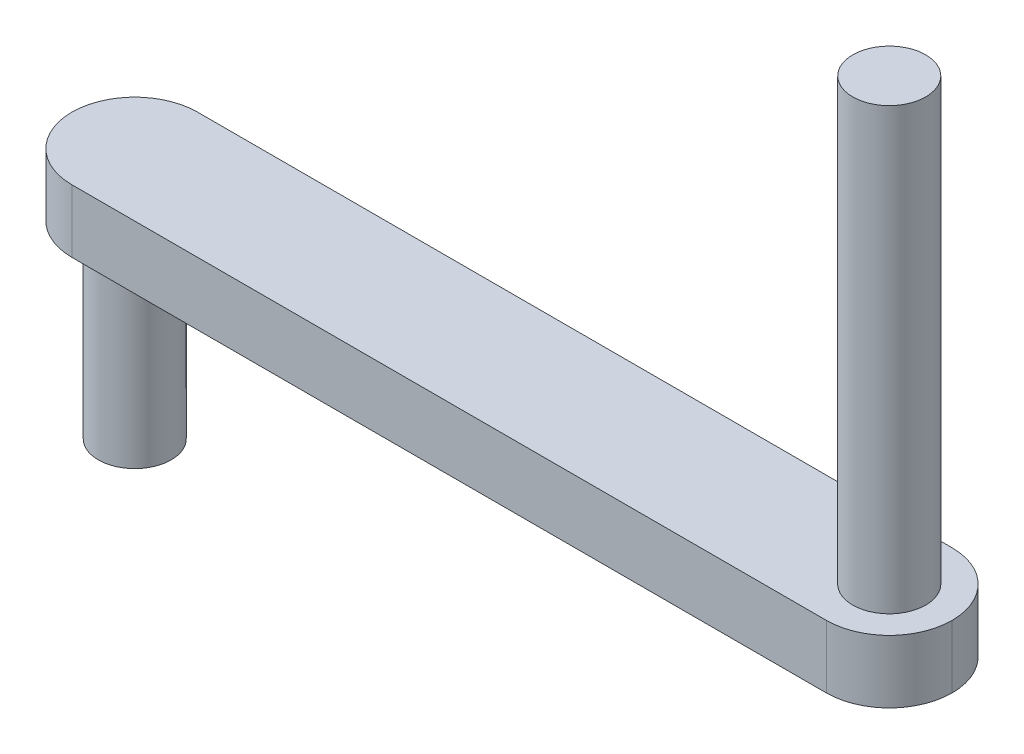
ISO-10303-21;
HEADER;
FILE_DESCRIPTION(('STEP AP214'),'2;1');
FILE_NAME('part.step','',(''),(''),'','','');
FILE_SCHEMA(('AUTOMOTIVE_DESIGN { 1 0 10303 214 1 1 1 1 }'));
ENDSEC;
DATA;
#1=APPLICATION_CONTEXT('core data for automotive mechanical design processes');
#2=APPLICATION_PROTOCOL_DEFINITION('international standard','automotive_design',2000,#1);
#3=PRODUCT_CONTEXT('',#1,'mechanical');
#4=PRODUCT('Part','Part','',(#3));
#5=PRODUCT_RELATED_PRODUCT_CATEGORY('part','',(#4));
#6=PRODUCT_DEFINITION_FORMATION('','',#4);
#7=PRODUCT_DEFINITION_CONTEXT('part definition',#1,'design');
#8=PRODUCT_DEFINITION('design','',#6,#7);
#9=PRODUCT_DEFINITION_SHAPE('','',#8);
#10=(LENGTH_UNIT() NAMED_UNIT(*) SI_UNIT(.MILLI.,.METRE.));
#11=(NAMED_UNIT(*) PLANE_ANGLE_UNIT() SI_UNIT($,.RADIAN.));
#12=(NAMED_UNIT(*) SI_UNIT($,.STERADIAN.) SOLID_ANGLE_UNIT());
#13=UNCERTAINTY_MEASURE_WITH_UNIT(LENGTH_MEASURE(1.E-05),#10,'distance_accuracy_value','');
#14=(GEOMETRIC_REPRESENTATION_CONTEXT(3) GLOBAL_UNCERTAINTY_ASSIGNED_CONTEXT((#13)) GLOBAL_UNIT_ASSIGNED_CONTEXT((#10,
#11,#12)) REPRESENTATION_CONTEXT('',''));
#15=CARTESIAN_POINT('',(0.,0.,0.));
#16=DIRECTION('',(0.,0.,1.));
#17=DIRECTION('',(1.,0.,0.));
#18=AXIS2_PLACEMENT_3D('',#15,#16,#17);
#19=CARTESIAN_POINT('',(0.,5.,0.));
#20=DIRECTION('',(0.,0.,-1.));
#21=DIRECTION('',(-1.,0.,0.));
#22=AXIS2_PLACEMENT_3D('',#19,#20,#21);
#23=PLANE('',#22);
#24=DIRECTION('',(1.,0.,0.));
#25=VECTOR('',#24,1.);
#26=CARTESIAN_POINT('',(0.,0.,0.));
#27=LINE('',#26,#25);
#28=CARTESIAN_POINT('',(5.,0.,0.));
#29=VERTEX_POINT('',#28);
#30=CARTESIAN_POINT('',(65.,0.,0.));
#31=VERTEX_POINT('',#30);
#32=EDGE_CURVE('E123',#29,#31,#27,.T.);
#33=ORIENTED_EDGE('',*,*,#32,.T.);
#34=DIRECTION('',(0.,-1.,0.));
#35=VECTOR('',#34,1.);
#36=CARTESIAN_POINT('',(65.,5.,0.));
#37=LINE('',#36,#35);
#38=CARTESIAN_POINT('',(65.,5.,0.));
#39=VERTEX_POINT('',#38);
#40=EDGE_CURVE('E48',#31,#39,#37,.F.);
#41=ORIENTED_EDGE('',*,*,#40,.T.);
#42=DIRECTION('',(1.,0.,0.));
#43=VECTOR('',#42,1.);
#44=CARTESIAN_POINT('',(0.,5.,0.));
#45=LINE('',#44,#43);
#46=CARTESIAN_POINT('',(5.,5.,0.));
#47=VERTEX_POINT('',#46);
#48=EDGE_CURVE('E122',#47,#39,#45,.T.);
#49=ORIENTED_EDGE('',*,*,#48,.F.);
#50=DIRECTION('',(0.,-1.,0.));
#51=VECTOR('',#50,1.);
#52=CARTESIAN_POINT('',(5.,5.,0.));
#53=LINE('',#52,#51);
#54=EDGE_CURVE('E139',#47,#29,#53,.T.);
#55=ORIENTED_EDGE('',*,*,#54,.T.);
#56=EDGE_LOOP('',(#33,#41,#49,#55));
#57=FACE_BOUND('',#56,.T.);
#58=ADVANCED_FACE('F39',(#57),#23,.F.);
#59=CARTESIAN_POINT('',(0.,5.,-10.));
#60=DIRECTION('',(0.,0.,1.));
#61=DIRECTION('',(1.,0.,0.));
#62=AXIS2_PLACEMENT_3D('',#59,#60,#61);
#63=PLANE('',#62);
#64=DIRECTION('',(-1.,0.,0.));
#65=VECTOR('',#64,1.);
#66=CARTESIAN_POINT('',(0.,5.,-10.));
#67=LINE('',#66,#65);
#68=CARTESIAN_POINT('',(65.,5.,-10.));
#69=VERTEX_POINT('',#68);
#70=CARTESIAN_POINT('',(5.,5.,-10.));
#71=VERTEX_POINT('',#70);
#72=EDGE_CURVE('E115',#69,#71,#67,.T.);
#73=ORIENTED_EDGE('',*,*,#72,.F.);
#74=DIRECTION('',(0.,-1.,0.));
#75=VECTOR('',#74,1.);
#76=CARTESIAN_POINT('',(65.,5.,-10.));
#77=LINE('',#76,#75);
#78=CARTESIAN_POINT('',(65.,0.,-10.));
#79=VERTEX_POINT('',#78);
#80=EDGE_CURVE('E99',#69,#79,#77,.T.);
#81=ORIENTED_EDGE('',*,*,#80,.T.);
#82=DIRECTION('',(-1.,0.,0.));
#83=VECTOR('',#82,1.);
#84=CARTESIAN_POINT('',(0.,0.,-10.));
#85=LINE('',#84,#83);
#86=CARTESIAN_POINT('',(5.,0.,-10.));
#87=VERTEX_POINT('',#86);
#88=EDGE_CURVE('E112',#79,#87,#85,.T.);
#89=ORIENTED_EDGE('',*,*,#88,.T.);
#90=DIRECTION('',(0.,-1.,0.));
#91=VECTOR('',#90,1.);
#92=CARTESIAN_POINT('',(5.,5.,-10.));
#93=LINE('',#92,#91);
#94=EDGE_CURVE('E117',#87,#71,#93,.F.);
#95=ORIENTED_EDGE('',*,*,#94,.T.);
#96=EDGE_LOOP('',(#73,#81,#89,#95));
#97=FACE_BOUND('',#96,.T.);
#98=ADVANCED_FACE('F110',(#97),#63,.F.);
#99=CARTESIAN_POINT('',(0.,5.,0.));
#100=DIRECTION('',(0.,-1.,0.));
#101=DIRECTION('',(0.,0.,-1.));
#102=AXIS2_PLACEMENT_3D('',#99,#100,#101);
#103=PLANE('',#102);
#104=CARTESIAN_POINT('',(65.,5.,-5.));
#105=DIRECTION('',(0.,1.,0.));
#106=DIRECTION('',(0.,0.,1.));
#107=AXIS2_PLACEMENT_3D('',#104,#105,#106);
#108=CIRCLE('',#107,2.9);
#109=CARTESIAN_POINT('',(65.,5.,-2.1));
#110=VERTEX_POINT('',#109);
#111=EDGE_CURVE('E11',#110,#110,#108,.T.);
#112=ORIENTED_EDGE('',*,*,#111,.F.);
#113=EDGE_LOOP('',(#112));
#114=FACE_BOUND('',#113,.T.);
#115=CARTESIAN_POINT('',(65.,5.,-5.));
#116=DIRECTION('',(0.,-1.,0.));
#117=DIRECTION('',(0.,0.,-1.));
#118=AXIS2_PLACEMENT_3D('',#115,#116,#117);
#119=CIRCLE('',#118,5.);
#120=CARTESIAN_POINT('',(70.,5.,-5.));
#121=VERTEX_POINT('',#120);
#122=EDGE_CURVE('E56',#39,#121,#119,.F.);
#123=ORIENTED_EDGE('',*,*,#122,.T.);
#124=CARTESIAN_POINT('',(65.,5.,-5.));
#125=DIRECTION('',(0.,-1.,0.));
#126=DIRECTION('',(0.,0.,-1.));
#127=AXIS2_PLACEMENT_3D('',#124,#125,#126);
#128=CIRCLE('',#127,5.);
#129=EDGE_CURVE('E137',#121,#69,#128,.F.);
#130=ORIENTED_EDGE('',*,*,#129,.T.);
#131=ORIENTED_EDGE('',*,*,#72,.T.);
#132=CARTESIAN_POINT('',(5.,5.,-5.));
#133=DIRECTION('',(0.,-1.,0.));
#134=DIRECTION('',(0.,0.,-1.));
#135=AXIS2_PLACEMENT_3D('',#132,#133,#134);
#136=CIRCLE('',#135,5.);
#137=CARTESIAN_POINT('',(0.,5.,-5.));
#138=VERTEX_POINT('',#137);
#139=EDGE_CURVE('E134',#71,#138,#136,.F.);
#140=ORIENTED_EDGE('',*,*,#139,.T.);
#141=CARTESIAN_POINT('',(5.,5.,-5.));
#142=DIRECTION('',(0.,-1.,0.));
#143=DIRECTION('',(0.,0.,-1.));
#144=AXIS2_PLACEMENT_3D('',#141,#142,#143);
#145=CIRCLE('',#144,5.);
#146=EDGE_CURVE('E104',#138,#47,#145,.F.);
#147=ORIENTED_EDGE('',*,*,#146,.T.);
#148=ORIENTED_EDGE('',*,*,#48,.T.);
#149=EDGE_LOOP('',(#123,#130,#131,#140,#147,#148));
#150=FACE_BOUND('',#149,.T.);
#151=ADVANCED_FACE('F154',(#114,#150),#103,.F.);
#152=CARTESIAN_POINT('',(0.,0.,0.));
#153=DIRECTION('',(0.,-1.,0.));
#154=DIRECTION('',(0.,0.,-1.));
#155=AXIS2_PLACEMENT_3D('',#152,#153,#154);
#156=PLANE('',#155);
#157=CARTESIAN_POINT('',(5.,0.,-5.));
#158=DIRECTION('',(0.,-1.,0.));
#159=DIRECTION('',(0.,0.,-1.));
#160=AXIS2_PLACEMENT_3D('',#157,#158,#159);
#161=CIRCLE('',#160,2.9);
#162=CARTESIAN_POINT('',(5.,0.,-7.9));
#163=VERTEX_POINT('',#162);
#164=EDGE_CURVE('E146',#163,#163,#161,.T.);
#165=ORIENTED_EDGE('',*,*,#164,.F.);
#166=EDGE_LOOP('',(#165));
#167=FACE_BOUND('',#166,.T.);
#168=ORIENTED_EDGE('',*,*,#88,.F.);
#169=CARTESIAN_POINT('',(65.,0.,-5.));
#170=DIRECTION('',(0.,-1.,0.));
#171=DIRECTION('',(0.,0.,-1.));
#172=AXIS2_PLACEMENT_3D('',#169,#170,#171);
#173=CIRCLE('',#172,5.);
#174=CARTESIAN_POINT('',(70.,0.,-5.));
#175=VERTEX_POINT('',#174);
#176=EDGE_CURVE('E95',#79,#175,#173,.T.);
#177=ORIENTED_EDGE('',*,*,#176,.T.);
#178=CARTESIAN_POINT('',(65.,0.,-5.));
#179=DIRECTION('',(0.,-1.,0.));
#180=DIRECTION('',(0.,0.,-1.));
#181=AXIS2_PLACEMENT_3D('',#178,#179,#180);
#182=CIRCLE('',#181,5.);
#183=EDGE_CURVE('E105',#175,#31,#182,.T.);
#184=ORIENTED_EDGE('',*,*,#183,.T.);
#185=ORIENTED_EDGE('',*,*,#32,.F.);
#186=CARTESIAN_POINT('',(5.,0.,-5.));
#187=DIRECTION('',(0.,-1.,0.));
#188=DIRECTION('',(0.,0.,-1.));
#189=AXIS2_PLACEMENT_3D('',#186,#187,#188);
#190=CIRCLE('',#189,5.);
#191=CARTESIAN_POINT('',(0.,0.,-5.));
#192=VERTEX_POINT('',#191);
#193=EDGE_CURVE('E116',#29,#192,#190,.T.);
#194=ORIENTED_EDGE('',*,*,#193,.T.);
#195=CARTESIAN_POINT('',(5.,0.,-5.));
#196=DIRECTION('',(0.,-1.,0.));
#197=DIRECTION('',(0.,0.,-1.));
#198=AXIS2_PLACEMENT_3D('',#195,#196,#197);
#199=CIRCLE('',#198,5.);
#200=EDGE_CURVE('E121',#192,#87,#199,.T.);
#201=ORIENTED_EDGE('',*,*,#200,.T.);
#202=EDGE_LOOP('',(#168,#177,#184,#185,#194,#201));
#203=FACE_BOUND('',#202,.T.);
#204=ADVANCED_FACE('F119',(#167,#203),#156,.T.);
#205=CARTESIAN_POINT('',(65.,5.,-5.));
#206=DIRECTION('',(0.,-1.,0.));
#207=DIRECTION('',(0.,0.,-1.));
#208=AXIS2_PLACEMENT_3D('',#205,#206,#207);
#209=CYLINDRICAL_SURFACE('',#208,5.);
#210=DIRECTION('',(0.,-1.,0.));
#211=VECTOR('',#210,1.);
#212=CARTESIAN_POINT('',(70.,5.,-5.));
#213=LINE('',#212,#211);
#214=EDGE_CURVE('E100',#121,#175,#213,.T.);
#215=ORIENTED_EDGE('',*,*,#214,.F.);
#216=ORIENTED_EDGE('',*,*,#122,.F.);
#217=ORIENTED_EDGE('',*,*,#40,.F.);
#218=ORIENTED_EDGE('',*,*,#183,.F.);
#219=EDGE_LOOP('',(#215,#216,#217,#218));
#220=FACE_BOUND('',#219,.T.);
#221=ADVANCED_FACE('F161',(#220),#209,.T.);
#222=CARTESIAN_POINT('',(65.,5.,-5.));
#223=DIRECTION('',(0.,-1.,0.));
#224=DIRECTION('',(0.,0.,-1.));
#225=AXIS2_PLACEMENT_3D('',#222,#223,#224);
#226=CYLINDRICAL_SURFACE('',#225,5.);
#227=ORIENTED_EDGE('',*,*,#129,.F.);
#228=ORIENTED_EDGE('',*,*,#214,.T.);
#229=ORIENTED_EDGE('',*,*,#176,.F.);
#230=ORIENTED_EDGE('',*,*,#80,.F.);
#231=EDGE_LOOP('',(#227,#228,#229,#230));
#232=FACE_BOUND('',#231,.T.);
#233=ADVANCED_FACE('F98',(#232),#226,.T.);
#234=CARTESIAN_POINT('',(5.,5.,-5.));
#235=DIRECTION('',(0.,-1.,0.));
#236=DIRECTION('',(0.,0.,-1.));
#237=AXIS2_PLACEMENT_3D('',#234,#235,#236);
#238=CYLINDRICAL_SURFACE('',#237,5.);
#239=ORIENTED_EDGE('',*,*,#54,.F.);
#240=ORIENTED_EDGE('',*,*,#146,.F.);
#241=DIRECTION('',(0.,-1.,0.));
#242=VECTOR('',#241,1.);
#243=CARTESIAN_POINT('',(0.,5.,-5.));
#244=LINE('',#243,#242);
#245=EDGE_CURVE('E43',#192,#138,#244,.F.);
#246=ORIENTED_EDGE('',*,*,#245,.F.);
#247=ORIENTED_EDGE('',*,*,#193,.F.);
#248=EDGE_LOOP('',(#239,#240,#246,#247));
#249=FACE_BOUND('',#248,.T.);
#250=ADVANCED_FACE('F41',(#249),#238,.T.);
#251=CARTESIAN_POINT('',(5.,5.,-5.));
#252=DIRECTION('',(0.,-1.,0.));
#253=DIRECTION('',(0.,0.,-1.));
#254=AXIS2_PLACEMENT_3D('',#251,#252,#253);
#255=CYLINDRICAL_SURFACE('',#254,5.);
#256=ORIENTED_EDGE('',*,*,#139,.F.);
#257=ORIENTED_EDGE('',*,*,#94,.F.);
#258=ORIENTED_EDGE('',*,*,#200,.F.);
#259=ORIENTED_EDGE('',*,*,#245,.T.);
#260=EDGE_LOOP('',(#256,#257,#258,#259));
#261=FACE_BOUND('',#260,.T.);
#262=ADVANCED_FACE('F185',(#261),#255,.T.);
#263=CARTESIAN_POINT('',(5.,-15.,-5.));
#264=DIRECTION('',(0.,1.,0.));
#265=DIRECTION('',(0.,0.,1.));
#266=AXIS2_PLACEMENT_3D('',#263,#264,#265);
#267=CYLINDRICAL_SURFACE('',#266,2.9);
#268=CARTESIAN_POINT('',(5.,-15.,-5.));
#269=DIRECTION('',(0.,-1.,0.));
#270=DIRECTION('',(0.,0.,-1.));
#271=AXIS2_PLACEMENT_3D('',#268,#269,#270);
#272=CIRCLE('',#271,2.9);
#273=CARTESIAN_POINT('',(5.,-15.,-7.9));
#274=VERTEX_POINT('',#273);
#275=EDGE_CURVE('E142',#274,#274,#272,.T.);
#276=ORIENTED_EDGE('',*,*,#275,.F.);
#277=EDGE_LOOP('',(#276));
#278=FACE_BOUND('',#277,.T.);
#279=ORIENTED_EDGE('',*,*,#164,.T.);
#280=EDGE_LOOP('',(#279));
#281=FACE_BOUND('',#280,.T.);
#282=ADVANCED_FACE('F181',(#278,#281),#267,.T.);
#283=CARTESIAN_POINT('',(5.,-15.,-5.));
#284=DIRECTION('',(0.,-1.,0.));
#285=DIRECTION('',(0.,0.,-1.));
#286=AXIS2_PLACEMENT_3D('',#283,#284,#285);
#287=PLANE('',#286);
#288=ORIENTED_EDGE('',*,*,#275,.T.);
#289=EDGE_LOOP('',(#288));
#290=FACE_BOUND('',#289,.T.);
#291=ADVANCED_FACE('F184',(#290),#287,.T.);
#292=CARTESIAN_POINT('',(65.,40.,-5.));
#293=DIRECTION('',(0.,-1.,0.));
#294=DIRECTION('',(0.,0.,-1.));
#295=AXIS2_PLACEMENT_3D('',#292,#293,#294);
#296=CYLINDRICAL_SURFACE('',#295,2.9);
#297=CARTESIAN_POINT('',(65.,40.,-5.));
#298=DIRECTION('',(0.,1.,0.));
#299=DIRECTION('',(0.,0.,1.));
#300=AXIS2_PLACEMENT_3D('',#297,#298,#299);
#301=CIRCLE('',#300,2.9);
#302=CARTESIAN_POINT('',(65.,40.,-2.1));
#303=VERTEX_POINT('',#302);
#304=EDGE_CURVE('E151',#303,#303,#301,.T.);
#305=ORIENTED_EDGE('',*,*,#304,.F.);
#306=EDGE_LOOP('',(#305));
#307=FACE_BOUND('',#306,.T.);
#308=ORIENTED_EDGE('',*,*,#111,.T.);
#309=EDGE_LOOP('',(#308));
#310=FACE_BOUND('',#309,.T.);
#311=ADVANCED_FACE('F189',(#307,#310),#296,.T.);
#312=CARTESIAN_POINT('',(65.,40.,-5.));
#313=DIRECTION('',(0.,1.,0.));
#314=DIRECTION('',(0.,0.,1.));
#315=AXIS2_PLACEMENT_3D('',#312,#313,#314);
#316=PLANE('',#315);
#317=ORIENTED_EDGE('',*,*,#304,.T.);
#318=EDGE_LOOP('',(#317));
#319=FACE_BOUND('',#318,.T.);
#320=ADVANCED_FACE('F192',(#319),#316,.T.);
#321=CLOSED_SHELL('',(#58,#98,#151,#204,#221,#233,#250,#262,#282,#291,#311,#320));
#322=MANIFOLD_SOLID_BREP('B2',#321);
#323=ADVANCED_BREP_SHAPE_REPRESENTATION('',(#18,#322),#14);
#324=SHAPE_DEFINITION_REPRESENTATION(#9,#323);
ENDSEC;
END-ISO-10303-21;
